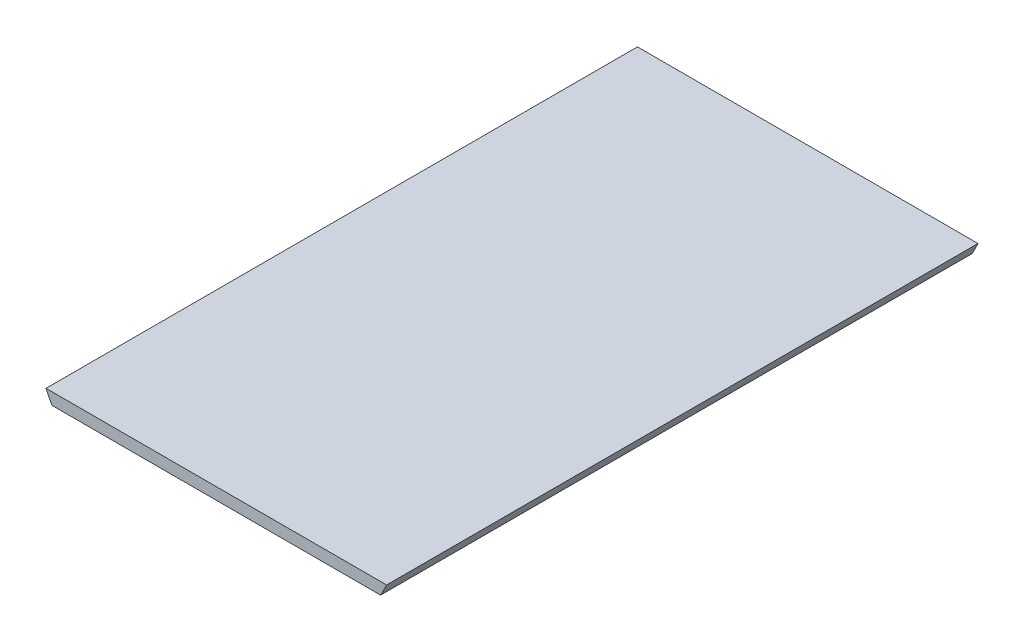
ISO-10303-21;
HEADER;
FILE_DESCRIPTION(('STEP AP214'),'2;1');
FILE_NAME('part.step','',(''),(''),'','','');
FILE_SCHEMA(('AUTOMOTIVE_DESIGN { 1 0 10303 214 1 1 1 1 }'));
ENDSEC;
DATA;
#1=APPLICATION_CONTEXT('core data for automotive mechanical design processes');
#2=APPLICATION_PROTOCOL_DEFINITION('international standard','automotive_design',2000,#1);
#3=PRODUCT_CONTEXT('',#1,'mechanical');
#4=PRODUCT('Part','Part','',(#3));
#5=PRODUCT_RELATED_PRODUCT_CATEGORY('part','',(#4));
#6=PRODUCT_DEFINITION_FORMATION('','',#4);
#7=PRODUCT_DEFINITION_CONTEXT('part definition',#1,'design');
#8=PRODUCT_DEFINITION('design','',#6,#7);
#9=PRODUCT_DEFINITION_SHAPE('','',#8);
#10=(LENGTH_UNIT() NAMED_UNIT(*) SI_UNIT(.MILLI.,.METRE.));
#11=(NAMED_UNIT(*) PLANE_ANGLE_UNIT() SI_UNIT($,.RADIAN.));
#12=(NAMED_UNIT(*) SI_UNIT($,.STERADIAN.) SOLID_ANGLE_UNIT());
#13=UNCERTAINTY_MEASURE_WITH_UNIT(LENGTH_MEASURE(1.E-05),#10,'distance_accuracy_value','');
#14=(GEOMETRIC_REPRESENTATION_CONTEXT(3) GLOBAL_UNCERTAINTY_ASSIGNED_CONTEXT((#13)) GLOBAL_UNIT_ASSIGNED_CONTEXT((#10,
#11,#12)) REPRESENTATION_CONTEXT('',''));
#15=CARTESIAN_POINT('',(0.,0.,0.));
#16=DIRECTION('',(0.,0.,1.));
#17=DIRECTION('',(1.,0.,0.));
#18=AXIS2_PLACEMENT_3D('',#15,#16,#17);
#19=CARTESIAN_POINT('',(0.,0.,160.02));
#20=DIRECTION('',(0.,0.,-1.));
#21=DIRECTION('',(-1.,0.,0.));
#22=AXIS2_PLACEMENT_3D('',#19,#20,#21);
#23=CYLINDRICAL_SURFACE('',#22,50.8);
#24=CARTESIAN_POINT('',(0.,0.,0.));
#25=DIRECTION('',(0.,0.,1.));
#26=DIRECTION('',(1.,0.,0.));
#27=AXIS2_PLACEMENT_3D('',#24,#25,#26);
#28=CIRCLE('',#27,50.8);
#29=CARTESIAN_POINT('',(-46.075781683931,-21.3930442484171,0.));
#30=VERTEX_POINT('',#29);
#31=CARTESIAN_POINT('',(-44.45,-24.5934442484171,0.));
#32=VERTEX_POINT('',#31);
#33=EDGE_CURVE('E95',#30,#32,#28,.T.);
#34=ORIENTED_EDGE('',*,*,#33,.T.);
#35=DIRECTION('',(0.,0.,-1.));
#36=VECTOR('',#35,1.);
#37=CARTESIAN_POINT('',(-44.45,-24.5934442484171,160.02));
#38=LINE('',#37,#36);
#39=CARTESIAN_POINT('',(-44.45,-24.5934442484171,160.02));
#40=VERTEX_POINT('',#39);
#41=EDGE_CURVE('E11',#40,#32,#38,.T.);
#42=ORIENTED_EDGE('',*,*,#41,.F.);
#43=CARTESIAN_POINT('',(0.,0.,160.02));
#44=DIRECTION('',(0.,0.,1.));
#45=DIRECTION('',(1.,0.,0.));
#46=AXIS2_PLACEMENT_3D('',#43,#44,#45);
#47=CIRCLE('',#46,50.8);
#48=CARTESIAN_POINT('',(-46.075781683931,-21.3930442484171,160.02));
#49=VERTEX_POINT('',#48);
#50=EDGE_CURVE('E81',#49,#40,#47,.T.);
#51=ORIENTED_EDGE('',*,*,#50,.F.);
#52=DIRECTION('',(0.,0.,-1.));
#53=VECTOR('',#52,1.);
#54=CARTESIAN_POINT('',(-46.075781683931,-21.3930442484171,160.02));
#55=LINE('',#54,#53);
#56=EDGE_CURVE('E48',#49,#30,#55,.T.);
#57=ORIENTED_EDGE('',*,*,#56,.T.);
#58=EDGE_LOOP('',(#34,#42,#51,#57));
#59=FACE_BOUND('',#58,.T.);
#60=ADVANCED_FACE('F32',(#59),#23,.T.);
#61=CARTESIAN_POINT('',(-44.45,-24.5934442484171,160.02));
#62=DIRECTION('',(0.,1.,0.));
#63=DIRECTION('',(0.,0.,1.));
#64=AXIS2_PLACEMENT_3D('',#61,#62,#63);
#65=PLANE('',#64);
#66=DIRECTION('',(1.,0.,0.));
#67=VECTOR('',#66,1.);
#68=CARTESIAN_POINT('',(-44.45,-24.5934442484171,0.));
#69=LINE('',#68,#67);
#70=CARTESIAN_POINT('',(44.45,-24.5934442484171,0.));
#71=VERTEX_POINT('',#70);
#72=EDGE_CURVE('E86',#32,#71,#69,.T.);
#73=ORIENTED_EDGE('',*,*,#72,.T.);
#74=DIRECTION('',(0.,0.,-1.));
#75=VECTOR('',#74,1.);
#76=CARTESIAN_POINT('',(44.45,-24.5934442484171,160.02));
#77=LINE('',#76,#75);
#78=CARTESIAN_POINT('',(44.45,-24.5934442484171,160.02));
#79=VERTEX_POINT('',#78);
#80=EDGE_CURVE('E40',#79,#71,#77,.T.);
#81=ORIENTED_EDGE('',*,*,#80,.F.);
#82=DIRECTION('',(1.,0.,0.));
#83=VECTOR('',#82,1.);
#84=CARTESIAN_POINT('',(-44.45,-24.5934442484171,160.02));
#85=LINE('',#84,#83);
#86=EDGE_CURVE('E74',#40,#79,#85,.T.);
#87=ORIENTED_EDGE('',*,*,#86,.F.);
#88=ORIENTED_EDGE('',*,*,#41,.T.);
#89=EDGE_LOOP('',(#73,#81,#87,#88));
#90=FACE_BOUND('',#89,.T.);
#91=ADVANCED_FACE('F85',(#90),#65,.F.);
#92=CARTESIAN_POINT('',(0.,0.,160.02));
#93=DIRECTION('',(0.,0.,-1.));
#94=DIRECTION('',(-1.,0.,0.));
#95=AXIS2_PLACEMENT_3D('',#92,#93,#94);
#96=CYLINDRICAL_SURFACE('',#95,50.8);
#97=CARTESIAN_POINT('',(0.,0.,0.));
#98=DIRECTION('',(0.,0.,1.));
#99=DIRECTION('',(1.,0.,0.));
#100=AXIS2_PLACEMENT_3D('',#97,#98,#99);
#101=CIRCLE('',#100,50.8);
#102=CARTESIAN_POINT('',(46.075781683931,-21.3930442484171,0.));
#103=VERTEX_POINT('',#102);
#104=EDGE_CURVE('E98',#71,#103,#101,.T.);
#105=ORIENTED_EDGE('',*,*,#104,.T.);
#106=DIRECTION('',(0.,0.,-1.));
#107=VECTOR('',#106,1.);
#108=CARTESIAN_POINT('',(46.075781683931,-21.3930442484171,160.02));
#109=LINE('',#108,#107);
#110=CARTESIAN_POINT('',(46.075781683931,-21.3930442484171,160.02));
#111=VERTEX_POINT('',#110);
#112=EDGE_CURVE('E63',#111,#103,#109,.T.);
#113=ORIENTED_EDGE('',*,*,#112,.F.);
#114=CARTESIAN_POINT('',(0.,0.,160.02));
#115=DIRECTION('',(0.,0.,1.));
#116=DIRECTION('',(1.,0.,0.));
#117=AXIS2_PLACEMENT_3D('',#114,#115,#116);
#118=CIRCLE('',#117,50.8);
#119=EDGE_CURVE('E80',#79,#111,#118,.T.);
#120=ORIENTED_EDGE('',*,*,#119,.F.);
#121=ORIENTED_EDGE('',*,*,#80,.T.);
#122=EDGE_LOOP('',(#105,#113,#120,#121));
#123=FACE_BOUND('',#122,.T.);
#124=ADVANCED_FACE('F89',(#123),#96,.T.);
#125=CARTESIAN_POINT('',(-46.075781683931,-21.3930442484171,160.02));
#126=DIRECTION('',(0.,1.,0.));
#127=DIRECTION('',(0.,0.,1.));
#128=AXIS2_PLACEMENT_3D('',#125,#126,#127);
#129=PLANE('',#128);
#130=DIRECTION('',(1.,0.,0.));
#131=VECTOR('',#130,1.);
#132=CARTESIAN_POINT('',(-46.075781683931,-21.3930442484171,0.));
#133=LINE('',#132,#131);
#134=EDGE_CURVE('E100',#30,#103,#133,.T.);
#135=ORIENTED_EDGE('',*,*,#134,.F.);
#136=ORIENTED_EDGE('',*,*,#56,.F.);
#137=DIRECTION('',(1.,0.,0.));
#138=VECTOR('',#137,1.);
#139=CARTESIAN_POINT('',(-46.075781683931,-21.3930442484171,160.02));
#140=LINE('',#139,#138);
#141=EDGE_CURVE('E90',#49,#111,#140,.T.);
#142=ORIENTED_EDGE('',*,*,#141,.T.);
#143=ORIENTED_EDGE('',*,*,#112,.T.);
#144=EDGE_LOOP('',(#135,#136,#142,#143));
#145=FACE_BOUND('',#144,.T.);
#146=ADVANCED_FACE('F106',(#145),#129,.T.);
#147=CARTESIAN_POINT('',(0.,0.,160.02));
#148=DIRECTION('',(0.,0.,1.));
#149=DIRECTION('',(1.,0.,0.));
#150=AXIS2_PLACEMENT_3D('',#147,#148,#149);
#151=PLANE('',#150);
#152=ORIENTED_EDGE('',*,*,#50,.T.);
#153=ORIENTED_EDGE('',*,*,#86,.T.);
#154=ORIENTED_EDGE('',*,*,#119,.T.);
#155=ORIENTED_EDGE('',*,*,#141,.F.);
#156=EDGE_LOOP('',(#152,#153,#154,#155));
#157=FACE_BOUND('',#156,.T.);
#158=ADVANCED_FACE('F77',(#157),#151,.T.);
#159=CARTESIAN_POINT('',(0.,0.,0.));
#160=DIRECTION('',(0.,0.,1.));
#161=DIRECTION('',(1.,0.,0.));
#162=AXIS2_PLACEMENT_3D('',#159,#160,#161);
#163=PLANE('',#162);
#164=ORIENTED_EDGE('',*,*,#33,.F.);
#165=ORIENTED_EDGE('',*,*,#134,.T.);
#166=ORIENTED_EDGE('',*,*,#104,.F.);
#167=ORIENTED_EDGE('',*,*,#72,.F.);
#168=EDGE_LOOP('',(#164,#165,#166,#167));
#169=FACE_BOUND('',#168,.T.);
#170=ADVANCED_FACE('F105',(#169),#163,.F.);
#171=CLOSED_SHELL('',(#60,#91,#124,#146,#158,#170));
#172=MANIFOLD_SOLID_BREP('B2',#171);
#173=ADVANCED_BREP_SHAPE_REPRESENTATION('',(#18,#172),#14);
#174=SHAPE_DEFINITION_REPRESENTATION(#9,#173);
ENDSEC;
END-ISO-10303-21;
